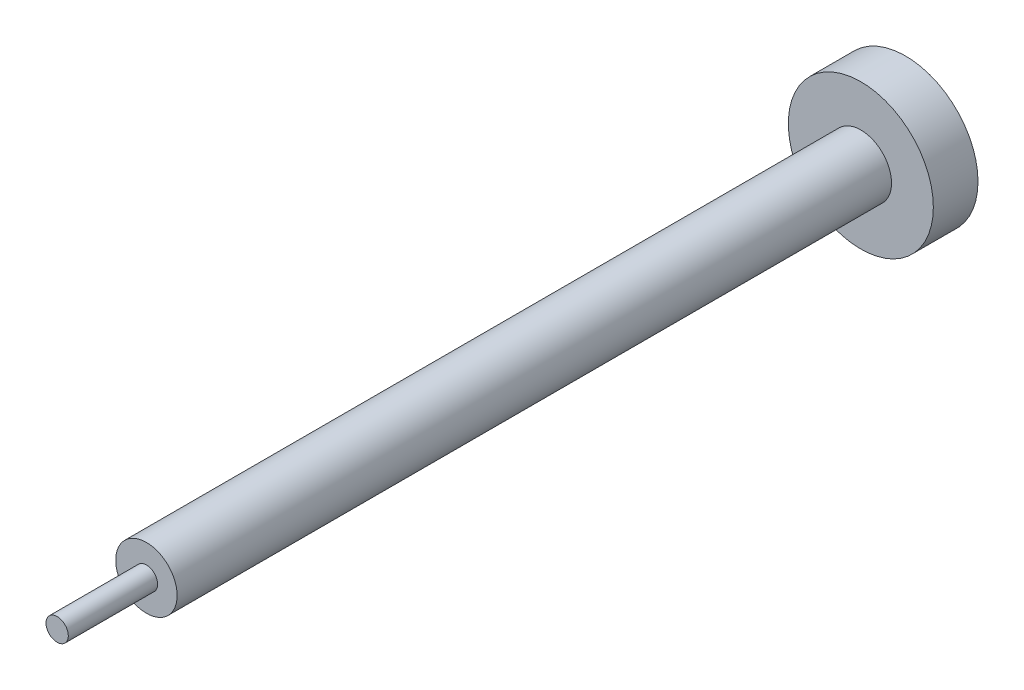
ISO-10303-21;
HEADER;
FILE_DESCRIPTION(('STEP AP214'),'2;1');
FILE_NAME('part.step','',(''),(''),'','','');
FILE_SCHEMA(('AUTOMOTIVE_DESIGN { 1 0 10303 214 1 1 1 1 }'));
ENDSEC;
DATA;
#1=APPLICATION_CONTEXT('core data for automotive mechanical design processes');
#2=APPLICATION_PROTOCOL_DEFINITION('international standard','automotive_design',2000,#1);
#3=PRODUCT_CONTEXT('',#1,'mechanical');
#4=PRODUCT('Part','Part','',(#3));
#5=PRODUCT_RELATED_PRODUCT_CATEGORY('part','',(#4));
#6=PRODUCT_DEFINITION_FORMATION('','',#4);
#7=PRODUCT_DEFINITION_CONTEXT('part definition',#1,'design');
#8=PRODUCT_DEFINITION('design','',#6,#7);
#9=PRODUCT_DEFINITION_SHAPE('','',#8);
#10=(LENGTH_UNIT() NAMED_UNIT(*) SI_UNIT(.MILLI.,.METRE.));
#11=(NAMED_UNIT(*) PLANE_ANGLE_UNIT() SI_UNIT($,.RADIAN.));
#12=(NAMED_UNIT(*) SI_UNIT($,.STERADIAN.) SOLID_ANGLE_UNIT());
#13=UNCERTAINTY_MEASURE_WITH_UNIT(LENGTH_MEASURE(1.E-05),#10,'distance_accuracy_value','');
#14=(GEOMETRIC_REPRESENTATION_CONTEXT(3) GLOBAL_UNCERTAINTY_ASSIGNED_CONTEXT((#13)) GLOBAL_UNIT_ASSIGNED_CONTEXT((#10,
#11,#12)) REPRESENTATION_CONTEXT('',''));
#15=CARTESIAN_POINT('',(0.,0.,0.));
#16=DIRECTION('',(0.,0.,1.));
#17=DIRECTION('',(1.,0.,0.));
#18=AXIS2_PLACEMENT_3D('',#15,#16,#17);
#19=CARTESIAN_POINT('',(0.,0.,17.2571122969419));
#20=DIRECTION('',(0.,0.,1.));
#21=DIRECTION('',(1.,0.,0.));
#22=AXIS2_PLACEMENT_3D('',#19,#20,#21);
#23=CYLINDRICAL_SURFACE('',#22,13.612368);
#24=CARTESIAN_POINT('',(0.,0.,17.2571122969419));
#25=DIRECTION('',(0.,0.,1.));
#26=DIRECTION('',(1.,0.,0.));
#27=AXIS2_PLACEMENT_3D('',#24,#25,#26);
#28=CIRCLE('',#27,13.612368);
#29=CARTESIAN_POINT('',(13.612368,0.,17.2571122969419));
#30=VERTEX_POINT('',#29);
#31=EDGE_CURVE('E50',#30,#30,#28,.T.);
#32=ORIENTED_EDGE('',*,*,#31,.T.);
#33=EDGE_LOOP('',(#32));
#34=FACE_BOUND('',#33,.T.);
#35=CARTESIAN_POINT('',(0.,0.,25.6391122969419));
#36=DIRECTION('',(0.,0.,1.));
#37=DIRECTION('',(1.,0.,0.));
#38=AXIS2_PLACEMENT_3D('',#35,#36,#37);
#39=CIRCLE('',#38,13.612368);
#40=CARTESIAN_POINT('',(13.612368,0.,25.6391122969419));
#41=VERTEX_POINT('',#40);
#42=EDGE_CURVE('E39',#41,#41,#39,.T.);
#43=ORIENTED_EDGE('',*,*,#42,.F.);
#44=EDGE_LOOP('',(#43));
#45=FACE_BOUND('',#44,.T.);
#46=ADVANCED_FACE('F36',(#34,#45),#23,.T.);
#47=CARTESIAN_POINT('',(0.,0.,17.2571122969419));
#48=DIRECTION('',(0.,0.,1.));
#49=DIRECTION('',(1.,0.,0.));
#50=AXIS2_PLACEMENT_3D('',#47,#48,#49);
#51=PLANE('',#50);
#52=ORIENTED_EDGE('',*,*,#31,.F.);
#53=EDGE_LOOP('',(#52));
#54=FACE_BOUND('',#53,.T.);
#55=ADVANCED_FACE('F69',(#54),#51,.F.);
#56=CARTESIAN_POINT('',(0.,0.,25.6391122969419));
#57=DIRECTION('',(0.,0.,1.));
#58=DIRECTION('',(1.,0.,0.));
#59=AXIS2_PLACEMENT_3D('',#56,#57,#58);
#60=PLANE('',#59);
#61=CARTESIAN_POINT('',(0.,0.,25.6391122969419));
#62=DIRECTION('',(0.,0.,1.));
#63=DIRECTION('',(1.,0.,0.));
#64=AXIS2_PLACEMENT_3D('',#61,#62,#63);
#65=CIRCLE('',#64,5.762625);
#66=CARTESIAN_POINT('',(5.762625,0.,25.6391122969419));
#67=VERTEX_POINT('',#66);
#68=EDGE_CURVE('E44',#67,#67,#65,.T.);
#69=ORIENTED_EDGE('',*,*,#68,.F.);
#70=EDGE_LOOP('',(#69));
#71=FACE_BOUND('',#70,.T.);
#72=ORIENTED_EDGE('',*,*,#42,.T.);
#73=EDGE_LOOP('',(#72));
#74=FACE_BOUND('',#73,.T.);
#75=ADVANCED_FACE('F66',(#71,#74),#60,.T.);
#76=CARTESIAN_POINT('',(0.,0.,159.751112296942));
#77=DIRECTION('',(0.,0.,-1.));
#78=DIRECTION('',(-1.,0.,0.));
#79=AXIS2_PLACEMENT_3D('',#76,#77,#78);
#80=CYLINDRICAL_SURFACE('',#79,5.762625);
#81=CARTESIAN_POINT('',(0.,0.,159.751112296942));
#82=DIRECTION('',(0.,0.,1.));
#83=DIRECTION('',(1.,0.,0.));
#84=AXIS2_PLACEMENT_3D('',#81,#82,#83);
#85=CIRCLE('',#84,5.762625);
#86=CARTESIAN_POINT('',(5.762625,0.,159.751112296942));
#87=VERTEX_POINT('',#86);
#88=EDGE_CURVE('E55',#87,#87,#85,.T.);
#89=ORIENTED_EDGE('',*,*,#88,.F.);
#90=EDGE_LOOP('',(#89));
#91=FACE_BOUND('',#90,.T.);
#92=ORIENTED_EDGE('',*,*,#68,.T.);
#93=EDGE_LOOP('',(#92));
#94=FACE_BOUND('',#93,.T.);
#95=ADVANCED_FACE('F78',(#91,#94),#80,.T.);
#96=CARTESIAN_POINT('',(0.,0.,159.751112296942));
#97=DIRECTION('',(0.,0.,1.));
#98=DIRECTION('',(1.,0.,0.));
#99=AXIS2_PLACEMENT_3D('',#96,#97,#98);
#100=PLANE('',#99);
#101=CARTESIAN_POINT('',(0.,0.,159.751112296942));
#102=DIRECTION('',(0.,0.,1.));
#103=DIRECTION('',(1.,0.,0.));
#104=AXIS2_PLACEMENT_3D('',#101,#102,#103);
#105=CIRCLE('',#104,2.0955);
#106=CARTESIAN_POINT('',(2.0955,0.,159.751112296942));
#107=VERTEX_POINT('',#106);
#108=EDGE_CURVE('E10',#107,#107,#105,.T.);
#109=ORIENTED_EDGE('',*,*,#108,.F.);
#110=EDGE_LOOP('',(#109));
#111=FACE_BOUND('',#110,.T.);
#112=ORIENTED_EDGE('',*,*,#88,.T.);
#113=EDGE_LOOP('',(#112));
#114=FACE_BOUND('',#113,.T.);
#115=ADVANCED_FACE('F83',(#111,#114),#100,.T.);
#116=CARTESIAN_POINT('',(0.,0.,176.515112296942));
#117=DIRECTION('',(0.,0.,-1.));
#118=DIRECTION('',(-1.,0.,0.));
#119=AXIS2_PLACEMENT_3D('',#116,#117,#118);
#120=CYLINDRICAL_SURFACE('',#119,2.0955);
#121=CARTESIAN_POINT('',(0.,0.,176.515112296942));
#122=DIRECTION('',(0.,0.,1.));
#123=DIRECTION('',(1.,0.,0.));
#124=AXIS2_PLACEMENT_3D('',#121,#122,#123);
#125=CIRCLE('',#124,2.0955);
#126=CARTESIAN_POINT('',(2.0955,0.,176.515112296942));
#127=VERTEX_POINT('',#126);
#128=EDGE_CURVE('E54',#127,#127,#125,.T.);
#129=ORIENTED_EDGE('',*,*,#128,.F.);
#130=EDGE_LOOP('',(#129));
#131=FACE_BOUND('',#130,.T.);
#132=ORIENTED_EDGE('',*,*,#108,.T.);
#133=EDGE_LOOP('',(#132));
#134=FACE_BOUND('',#133,.T.);
#135=ADVANCED_FACE('F87',(#131,#134),#120,.T.);
#136=CARTESIAN_POINT('',(0.,0.,176.515112296942));
#137=DIRECTION('',(0.,0.,1.));
#138=DIRECTION('',(1.,0.,0.));
#139=AXIS2_PLACEMENT_3D('',#136,#137,#138);
#140=PLANE('',#139);
#141=ORIENTED_EDGE('',*,*,#128,.T.);
#142=EDGE_LOOP('',(#141));
#143=FACE_BOUND('',#142,.T.);
#144=ADVANCED_FACE('F91',(#143),#140,.T.);
#145=CLOSED_SHELL('',(#46,#55,#75,#95,#115,#135,#144));
#146=MANIFOLD_SOLID_BREP('B2',#145);
#147=ADVANCED_BREP_SHAPE_REPRESENTATION('',(#18,#146),#14);
#148=SHAPE_DEFINITION_REPRESENTATION(#9,#147);
ENDSEC;
END-ISO-10303-21;
